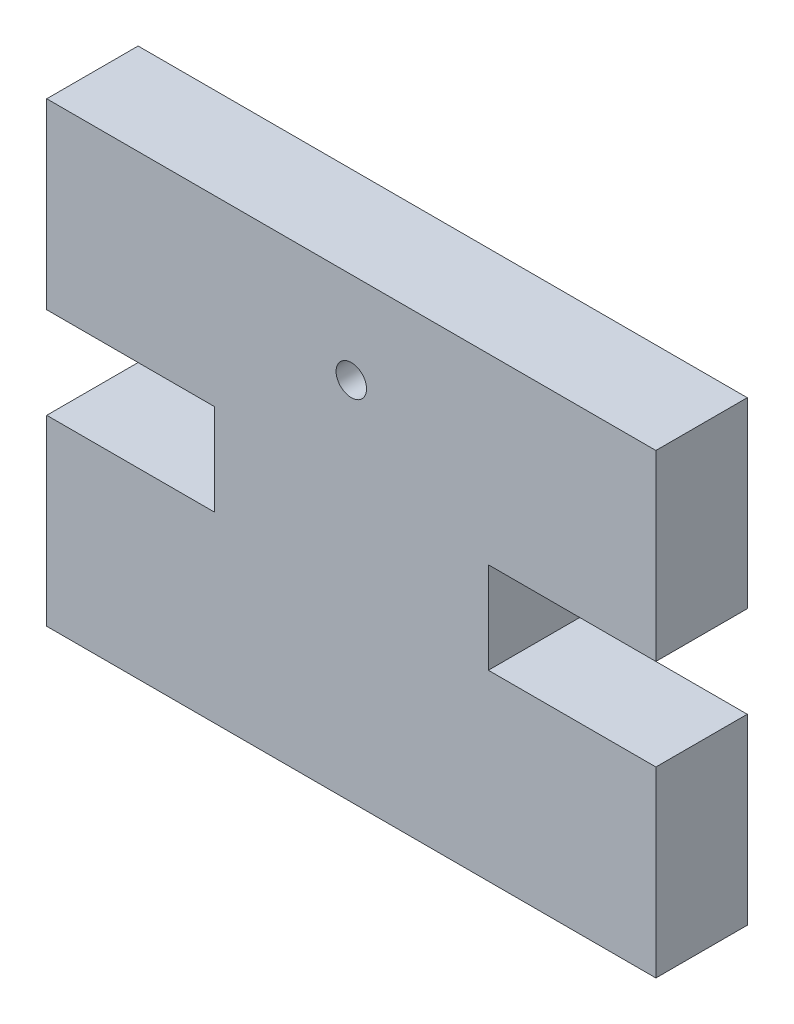
ISO-10303-21;
HEADER;
FILE_DESCRIPTION(('STEP AP214'),'2;1');
FILE_NAME('part.step','',(''),(''),'','','');
FILE_SCHEMA(('AUTOMOTIVE_DESIGN { 1 0 10303 214 1 1 1 1 }'));
ENDSEC;
DATA;
#1=APPLICATION_CONTEXT('core data for automotive mechanical design processes');
#2=APPLICATION_PROTOCOL_DEFINITION('international standard','automotive_design',2000,#1);
#3=PRODUCT_CONTEXT('',#1,'mechanical');
#4=PRODUCT('Part','Part','',(#3));
#5=PRODUCT_RELATED_PRODUCT_CATEGORY('part','',(#4));
#6=PRODUCT_DEFINITION_FORMATION('','',#4);
#7=PRODUCT_DEFINITION_CONTEXT('part definition',#1,'design');
#8=PRODUCT_DEFINITION('design','',#6,#7);
#9=PRODUCT_DEFINITION_SHAPE('','',#8);
#10=(LENGTH_UNIT() NAMED_UNIT(*) SI_UNIT(.MILLI.,.METRE.));
#11=(NAMED_UNIT(*) PLANE_ANGLE_UNIT() SI_UNIT($,.RADIAN.));
#12=(NAMED_UNIT(*) SI_UNIT($,.STERADIAN.) SOLID_ANGLE_UNIT());
#13=UNCERTAINTY_MEASURE_WITH_UNIT(LENGTH_MEASURE(1.E-05),#10,'distance_accuracy_value','');
#14=(GEOMETRIC_REPRESENTATION_CONTEXT(3) GLOBAL_UNCERTAINTY_ASSIGNED_CONTEXT((#13)) GLOBAL_UNIT_ASSIGNED_CONTEXT((#10,
#11,#12)) REPRESENTATION_CONTEXT('',''));
#15=CARTESIAN_POINT('',(0.,0.,0.));
#16=DIRECTION('',(0.,0.,1.));
#17=DIRECTION('',(1.,0.,0.));
#18=AXIS2_PLACEMENT_3D('',#15,#16,#17);
#19=CARTESIAN_POINT('',(0.,0.,3.));
#20=DIRECTION('',(0.,0.,1.));
#21=DIRECTION('',(1.,0.,0.));
#22=AXIS2_PLACEMENT_3D('',#19,#20,#21);
#23=PLANE('',#22);
#24=DIRECTION('',(0.,-1.,0.));
#25=VECTOR('',#24,1.);
#26=CARTESIAN_POINT('',(0.,0.,3.));
#27=LINE('',#26,#25);
#28=CARTESIAN_POINT('',(0.,3.,3.));
#29=VERTEX_POINT('',#28);
#30=CARTESIAN_POINT('',(0.,0.,3.));
#31=VERTEX_POINT('',#30);
#32=EDGE_CURVE('E93',#29,#31,#27,.T.);
#33=ORIENTED_EDGE('',*,*,#32,.T.);
#34=DIRECTION('',(-1.,0.,0.));
#35=VECTOR('',#34,1.);
#36=CARTESIAN_POINT('',(-5.5,0.,3.));
#37=LINE('',#36,#35);
#38=CARTESIAN_POINT('',(-5.5,0.,3.));
#39=VERTEX_POINT('',#38);
#40=EDGE_CURVE('E183',#31,#39,#37,.T.);
#41=ORIENTED_EDGE('',*,*,#40,.T.);
#42=DIRECTION('',(0.,1.,0.));
#43=VECTOR('',#42,1.);
#44=CARTESIAN_POINT('',(-5.5,-6.,3.));
#45=LINE('',#44,#43);
#46=CARTESIAN_POINT('',(-5.5,-6.,3.));
#47=VERTEX_POINT('',#46);
#48=EDGE_CURVE('E230',#47,#39,#45,.T.);
#49=ORIENTED_EDGE('',*,*,#48,.F.);
#50=DIRECTION('',(-1.,0.,0.));
#51=VECTOR('',#50,1.);
#52=CARTESIAN_POINT('',(-5.5,-6.,3.));
#53=LINE('',#52,#51);
#54=CARTESIAN_POINT('',(14.5,-6.,3.));
#55=VERTEX_POINT('',#54);
#56=EDGE_CURVE('E214',#55,#47,#53,.T.);
#57=ORIENTED_EDGE('',*,*,#56,.F.);
#58=DIRECTION('',(0.,1.,0.));
#59=VECTOR('',#58,1.);
#60=CARTESIAN_POINT('',(14.5,-6.,3.));
#61=LINE('',#60,#59);
#62=CARTESIAN_POINT('',(14.5,0.,3.));
#63=VERTEX_POINT('',#62);
#64=EDGE_CURVE('E180',#55,#63,#61,.T.);
#65=ORIENTED_EDGE('',*,*,#64,.T.);
#66=CARTESIAN_POINT('',(9.,0.,3.));
#67=VERTEX_POINT('',#66);
#68=EDGE_CURVE('E243',#63,#67,#37,.T.);
#69=ORIENTED_EDGE('',*,*,#68,.T.);
#70=DIRECTION('',(0.,1.,0.));
#71=VECTOR('',#70,1.);
#72=CARTESIAN_POINT('',(9.,0.,3.));
#73=LINE('',#72,#71);
#74=CARTESIAN_POINT('',(9.,3.,3.));
#75=VERTEX_POINT('',#74);
#76=EDGE_CURVE('E160',#67,#75,#73,.T.);
#77=ORIENTED_EDGE('',*,*,#76,.T.);
#78=DIRECTION('',(1.,0.,0.));
#79=VECTOR('',#78,1.);
#80=CARTESIAN_POINT('',(14.5,3.,3.));
#81=LINE('',#80,#79);
#82=CARTESIAN_POINT('',(14.5,3.,3.));
#83=VERTEX_POINT('',#82);
#84=EDGE_CURVE('E162',#75,#83,#81,.T.);
#85=ORIENTED_EDGE('',*,*,#84,.T.);
#86=DIRECTION('',(0.,1.,0.));
#87=VECTOR('',#86,1.);
#88=CARTESIAN_POINT('',(14.5,9.,3.));
#89=LINE('',#88,#87);
#90=CARTESIAN_POINT('',(14.5,9.,3.));
#91=VERTEX_POINT('',#90);
#92=EDGE_CURVE('E116',#83,#91,#89,.T.);
#93=ORIENTED_EDGE('',*,*,#92,.T.);
#94=DIRECTION('',(-1.,0.,0.));
#95=VECTOR('',#94,1.);
#96=CARTESIAN_POINT('',(-5.5,9.,3.));
#97=LINE('',#96,#95);
#98=CARTESIAN_POINT('',(-5.5,9.,3.));
#99=VERTEX_POINT('',#98);
#100=EDGE_CURVE('E110',#91,#99,#97,.T.);
#101=ORIENTED_EDGE('',*,*,#100,.T.);
#102=DIRECTION('',(0.,-1.,0.));
#103=VECTOR('',#102,1.);
#104=CARTESIAN_POINT('',(-5.5,9.,3.));
#105=LINE('',#104,#103);
#106=CARTESIAN_POINT('',(-5.5,3.,3.));
#107=VERTEX_POINT('',#106);
#108=EDGE_CURVE('E114',#99,#107,#105,.T.);
#109=ORIENTED_EDGE('',*,*,#108,.T.);
#110=DIRECTION('',(1.,0.,0.));
#111=VECTOR('',#110,1.);
#112=CARTESIAN_POINT('',(0.,3.,3.));
#113=LINE('',#112,#111);
#114=EDGE_CURVE('E54',#107,#29,#113,.T.);
#115=ORIENTED_EDGE('',*,*,#114,.T.);
#116=EDGE_LOOP('',(#33,#41,#49,#57,#65,#69,#77,#85,#93,#101,#109,#115));
#117=FACE_BOUND('',#116,.T.);
#118=CARTESIAN_POINT('',(4.5,6.,3.));
#119=DIRECTION('',(0.,0.,1.));
#120=DIRECTION('',(1.,0.,0.));
#121=AXIS2_PLACEMENT_3D('',#118,#119,#120);
#122=CIRCLE('',#121,0.500000000000001);
#123=CARTESIAN_POINT('',(5.,6.,3.));
#124=VERTEX_POINT('',#123);
#125=EDGE_CURVE('E169',#124,#124,#122,.T.);
#126=ORIENTED_EDGE('',*,*,#125,.F.);
#127=EDGE_LOOP('',(#126));
#128=FACE_BOUND('',#127,.T.);
#129=ADVANCED_FACE('F35',(#117,#128),#23,.T.);
#130=CARTESIAN_POINT('',(0.,0.,0.));
#131=DIRECTION('',(0.,0.,1.));
#132=DIRECTION('',(1.,0.,0.));
#133=AXIS2_PLACEMENT_3D('',#130,#131,#132);
#134=PLANE('',#133);
#135=DIRECTION('',(0.,-1.,0.));
#136=VECTOR('',#135,1.);
#137=CARTESIAN_POINT('',(0.,0.,0.));
#138=LINE('',#137,#136);
#139=CARTESIAN_POINT('',(0.,3.,0.));
#140=VERTEX_POINT('',#139);
#141=CARTESIAN_POINT('',(0.,0.,0.));
#142=VERTEX_POINT('',#141);
#143=EDGE_CURVE('E164',#140,#142,#138,.T.);
#144=ORIENTED_EDGE('',*,*,#143,.F.);
#145=DIRECTION('',(1.,0.,0.));
#146=VECTOR('',#145,1.);
#147=CARTESIAN_POINT('',(0.,3.,0.));
#148=LINE('',#147,#146);
#149=CARTESIAN_POINT('',(-5.5,3.,0.));
#150=VERTEX_POINT('',#149);
#151=EDGE_CURVE('E87',#150,#140,#148,.T.);
#152=ORIENTED_EDGE('',*,*,#151,.F.);
#153=DIRECTION('',(0.,-1.,0.));
#154=VECTOR('',#153,1.);
#155=CARTESIAN_POINT('',(-5.5,9.,0.));
#156=LINE('',#155,#154);
#157=CARTESIAN_POINT('',(-5.5,9.,0.));
#158=VERTEX_POINT('',#157);
#159=EDGE_CURVE('E81',#158,#150,#156,.T.);
#160=ORIENTED_EDGE('',*,*,#159,.F.);
#161=DIRECTION('',(-1.,0.,0.));
#162=VECTOR('',#161,1.);
#163=CARTESIAN_POINT('',(-5.5,9.,0.));
#164=LINE('',#163,#162);
#165=CARTESIAN_POINT('',(14.5,9.,0.));
#166=VERTEX_POINT('',#165);
#167=EDGE_CURVE('E124',#166,#158,#164,.T.);
#168=ORIENTED_EDGE('',*,*,#167,.F.);
#169=DIRECTION('',(0.,1.,0.));
#170=VECTOR('',#169,1.);
#171=CARTESIAN_POINT('',(14.5,9.,0.));
#172=LINE('',#171,#170);
#173=CARTESIAN_POINT('',(14.5,3.,0.));
#174=VERTEX_POINT('',#173);
#175=EDGE_CURVE('E136',#174,#166,#172,.T.);
#176=ORIENTED_EDGE('',*,*,#175,.F.);
#177=DIRECTION('',(1.,0.,0.));
#178=VECTOR('',#177,1.);
#179=CARTESIAN_POINT('',(14.5,3.,0.));
#180=LINE('',#179,#178);
#181=CARTESIAN_POINT('',(9.,3.,0.));
#182=VERTEX_POINT('',#181);
#183=EDGE_CURVE('E134',#182,#174,#180,.T.);
#184=ORIENTED_EDGE('',*,*,#183,.F.);
#185=DIRECTION('',(0.,1.,0.));
#186=VECTOR('',#185,1.);
#187=CARTESIAN_POINT('',(9.,0.,0.));
#188=LINE('',#187,#186);
#189=CARTESIAN_POINT('',(9.,0.,0.));
#190=VERTEX_POINT('',#189);
#191=EDGE_CURVE('E137',#190,#182,#188,.T.);
#192=ORIENTED_EDGE('',*,*,#191,.F.);
#193=DIRECTION('',(1.,0.,0.));
#194=VECTOR('',#193,1.);
#195=CARTESIAN_POINT('',(-5.5,0.,0.));
#196=LINE('',#195,#194);
#197=CARTESIAN_POINT('',(14.5,0.,0.));
#198=VERTEX_POINT('',#197);
#199=EDGE_CURVE('E211',#190,#198,#196,.T.);
#200=ORIENTED_EDGE('',*,*,#199,.T.);
#201=DIRECTION('',(0.,1.,0.));
#202=VECTOR('',#201,1.);
#203=CARTESIAN_POINT('',(14.5,-6.,0.));
#204=LINE('',#203,#202);
#205=CARTESIAN_POINT('',(14.5,-6.,0.));
#206=VERTEX_POINT('',#205);
#207=EDGE_CURVE('E225',#206,#198,#204,.T.);
#208=ORIENTED_EDGE('',*,*,#207,.F.);
#209=DIRECTION('',(1.,0.,0.));
#210=VECTOR('',#209,1.);
#211=CARTESIAN_POINT('',(-5.5,-6.,0.));
#212=LINE('',#211,#210);
#213=CARTESIAN_POINT('',(-5.5,-6.,0.));
#214=VERTEX_POINT('',#213);
#215=EDGE_CURVE('E229',#214,#206,#212,.T.);
#216=ORIENTED_EDGE('',*,*,#215,.F.);
#217=DIRECTION('',(0.,1.,0.));
#218=VECTOR('',#217,1.);
#219=CARTESIAN_POINT('',(-5.5,-6.,0.));
#220=LINE('',#219,#218);
#221=CARTESIAN_POINT('',(-5.5,0.,0.));
#222=VERTEX_POINT('',#221);
#223=EDGE_CURVE('E206',#214,#222,#220,.T.);
#224=ORIENTED_EDGE('',*,*,#223,.T.);
#225=EDGE_CURVE('E202',#222,#142,#196,.T.);
#226=ORIENTED_EDGE('',*,*,#225,.T.);
#227=EDGE_LOOP('',(#144,#152,#160,#168,#176,#184,#192,#200,#208,#216,#224,#226));
#228=FACE_BOUND('',#227,.T.);
#229=CARTESIAN_POINT('',(4.5,6.,0.));
#230=DIRECTION('',(0.,0.,1.));
#231=DIRECTION('',(1.,0.,0.));
#232=AXIS2_PLACEMENT_3D('',#229,#230,#231);
#233=CIRCLE('',#232,0.500000000000001);
#234=CARTESIAN_POINT('',(5.,6.,0.));
#235=VERTEX_POINT('',#234);
#236=EDGE_CURVE('E173',#235,#235,#233,.T.);
#237=ORIENTED_EDGE('',*,*,#236,.T.);
#238=EDGE_LOOP('',(#237));
#239=FACE_BOUND('',#238,.T.);
#240=ADVANCED_FACE('F197',(#228,#239),#134,.F.);
#241=CARTESIAN_POINT('',(0.,0.,3.));
#242=DIRECTION('',(1.,0.,0.));
#243=DIRECTION('',(0.,0.,-1.));
#244=AXIS2_PLACEMENT_3D('',#241,#242,#243);
#245=PLANE('',#244);
#246=ORIENTED_EDGE('',*,*,#143,.T.);
#247=DIRECTION('',(0.,0.,-1.));
#248=VECTOR('',#247,1.);
#249=CARTESIAN_POINT('',(0.,0.,3.));
#250=LINE('',#249,#248);
#251=EDGE_CURVE('E11',#31,#142,#250,.T.);
#252=ORIENTED_EDGE('',*,*,#251,.F.);
#253=ORIENTED_EDGE('',*,*,#32,.F.);
#254=DIRECTION('',(0.,0.,-1.));
#255=VECTOR('',#254,1.);
#256=CARTESIAN_POINT('',(0.,3.,3.));
#257=LINE('',#256,#255);
#258=EDGE_CURVE('E130',#29,#140,#257,.T.);
#259=ORIENTED_EDGE('',*,*,#258,.T.);
#260=EDGE_LOOP('',(#246,#252,#253,#259));
#261=FACE_BOUND('',#260,.T.);
#262=ADVANCED_FACE('F37',(#261),#245,.F.);
#263=CARTESIAN_POINT('',(9.,0.,3.));
#264=DIRECTION('',(-1.,0.,0.));
#265=DIRECTION('',(0.,0.,1.));
#266=AXIS2_PLACEMENT_3D('',#263,#264,#265);
#267=PLANE('',#266);
#268=ORIENTED_EDGE('',*,*,#191,.T.);
#269=DIRECTION('',(0.,0.,-1.));
#270=VECTOR('',#269,1.);
#271=CARTESIAN_POINT('',(9.,3.,3.));
#272=LINE('',#271,#270);
#273=EDGE_CURVE('E148',#75,#182,#272,.T.);
#274=ORIENTED_EDGE('',*,*,#273,.F.);
#275=ORIENTED_EDGE('',*,*,#76,.F.);
#276=DIRECTION('',(0.,0.,-1.));
#277=VECTOR('',#276,1.);
#278=CARTESIAN_POINT('',(9.,0.,3.));
#279=LINE('',#278,#277);
#280=EDGE_CURVE('E45',#67,#190,#279,.T.);
#281=ORIENTED_EDGE('',*,*,#280,.T.);
#282=EDGE_LOOP('',(#268,#274,#275,#281));
#283=FACE_BOUND('',#282,.T.);
#284=ADVANCED_FACE('F307',(#283),#267,.F.);
#285=CARTESIAN_POINT('',(14.5,3.,3.));
#286=DIRECTION('',(0.,1.,0.));
#287=DIRECTION('',(-1.,0.,0.));
#288=AXIS2_PLACEMENT_3D('',#285,#286,#287);
#289=PLANE('',#288);
#290=ORIENTED_EDGE('',*,*,#183,.T.);
#291=DIRECTION('',(0.,0.,-1.));
#292=VECTOR('',#291,1.);
#293=CARTESIAN_POINT('',(14.5,3.,3.));
#294=LINE('',#293,#292);
#295=EDGE_CURVE('E145',#83,#174,#294,.T.);
#296=ORIENTED_EDGE('',*,*,#295,.F.);
#297=ORIENTED_EDGE('',*,*,#84,.F.);
#298=ORIENTED_EDGE('',*,*,#273,.T.);
#299=EDGE_LOOP('',(#290,#296,#297,#298));
#300=FACE_BOUND('',#299,.T.);
#301=ADVANCED_FACE('F191',(#300),#289,.F.);
#302=CARTESIAN_POINT('',(14.5,9.,3.));
#303=DIRECTION('',(-1.,0.,0.));
#304=DIRECTION('',(0.,-1.,0.));
#305=AXIS2_PLACEMENT_3D('',#302,#303,#304);
#306=PLANE('',#305);
#307=ORIENTED_EDGE('',*,*,#175,.T.);
#308=DIRECTION('',(0.,0.,-1.));
#309=VECTOR('',#308,1.);
#310=CARTESIAN_POINT('',(14.5,9.,3.));
#311=LINE('',#310,#309);
#312=EDGE_CURVE('E125',#91,#166,#311,.T.);
#313=ORIENTED_EDGE('',*,*,#312,.F.);
#314=ORIENTED_EDGE('',*,*,#92,.F.);
#315=ORIENTED_EDGE('',*,*,#295,.T.);
#316=EDGE_LOOP('',(#307,#313,#314,#315));
#317=FACE_BOUND('',#316,.T.);
#318=ADVANCED_FACE('F195',(#317),#306,.F.);
#319=CARTESIAN_POINT('',(-5.5,9.,3.));
#320=DIRECTION('',(0.,-1.,0.));
#321=DIRECTION('',(1.,0.,0.));
#322=AXIS2_PLACEMENT_3D('',#319,#320,#321);
#323=PLANE('',#322);
#324=ORIENTED_EDGE('',*,*,#167,.T.);
#325=DIRECTION('',(0.,0.,-1.));
#326=VECTOR('',#325,1.);
#327=CARTESIAN_POINT('',(-5.5,9.,3.));
#328=LINE('',#327,#326);
#329=EDGE_CURVE('E121',#99,#158,#328,.T.);
#330=ORIENTED_EDGE('',*,*,#329,.F.);
#331=ORIENTED_EDGE('',*,*,#100,.F.);
#332=ORIENTED_EDGE('',*,*,#312,.T.);
#333=EDGE_LOOP('',(#324,#330,#331,#332));
#334=FACE_BOUND('',#333,.T.);
#335=ADVANCED_FACE('F122',(#334),#323,.F.);
#336=CARTESIAN_POINT('',(-5.5,9.,3.));
#337=DIRECTION('',(1.,0.,0.));
#338=DIRECTION('',(0.,1.,0.));
#339=AXIS2_PLACEMENT_3D('',#336,#337,#338);
#340=PLANE('',#339);
#341=ORIENTED_EDGE('',*,*,#159,.T.);
#342=DIRECTION('',(0.,0.,-1.));
#343=VECTOR('',#342,1.);
#344=CARTESIAN_POINT('',(-5.5,3.,3.));
#345=LINE('',#344,#343);
#346=EDGE_CURVE('E126',#107,#150,#345,.T.);
#347=ORIENTED_EDGE('',*,*,#346,.F.);
#348=ORIENTED_EDGE('',*,*,#108,.F.);
#349=ORIENTED_EDGE('',*,*,#329,.T.);
#350=EDGE_LOOP('',(#341,#347,#348,#349));
#351=FACE_BOUND('',#350,.T.);
#352=ADVANCED_FACE('F128',(#351),#340,.F.);
#353=CARTESIAN_POINT('',(0.,3.,3.));
#354=DIRECTION('',(0.,1.,0.));
#355=DIRECTION('',(-1.,0.,0.));
#356=AXIS2_PLACEMENT_3D('',#353,#354,#355);
#357=PLANE('',#356);
#358=ORIENTED_EDGE('',*,*,#151,.T.);
#359=ORIENTED_EDGE('',*,*,#258,.F.);
#360=ORIENTED_EDGE('',*,*,#114,.F.);
#361=ORIENTED_EDGE('',*,*,#346,.T.);
#362=EDGE_LOOP('',(#358,#359,#360,#361));
#363=FACE_BOUND('',#362,.T.);
#364=ADVANCED_FACE('F297',(#363),#357,.F.);
#365=CARTESIAN_POINT('',(4.5,6.,3.));
#366=DIRECTION('',(0.,0.,-1.));
#367=DIRECTION('',(-1.,0.,0.));
#368=AXIS2_PLACEMENT_3D('',#365,#366,#367);
#369=CYLINDRICAL_SURFACE('',#368,0.500000000000001);
#370=ORIENTED_EDGE('',*,*,#125,.T.);
#371=EDGE_LOOP('',(#370));
#372=FACE_BOUND('',#371,.T.);
#373=ORIENTED_EDGE('',*,*,#236,.F.);
#374=EDGE_LOOP('',(#373));
#375=FACE_BOUND('',#374,.T.);
#376=ADVANCED_FACE('F294',(#372,#375),#369,.F.);
#377=CARTESIAN_POINT('',(0.,0.,0.));
#378=DIRECTION('',(0.,-1.,0.));
#379=DIRECTION('',(0.,0.,-1.));
#380=AXIS2_PLACEMENT_3D('',#377,#378,#379);
#381=PLANE('',#380);
#382=ORIENTED_EDGE('',*,*,#40,.F.);
#383=ORIENTED_EDGE('',*,*,#251,.T.);
#384=ORIENTED_EDGE('',*,*,#225,.F.);
#385=DIRECTION('',(0.,0.,-1.));
#386=VECTOR('',#385,1.);
#387=CARTESIAN_POINT('',(-5.5,0.,3.));
#388=LINE('',#387,#386);
#389=EDGE_CURVE('E217',#39,#222,#388,.T.);
#390=ORIENTED_EDGE('',*,*,#389,.F.);
#391=EDGE_LOOP('',(#382,#383,#384,#390));
#392=FACE_BOUND('',#391,.T.);
#393=ADVANCED_FACE('F265',(#392),#381,.F.);
#394=CARTESIAN_POINT('',(14.5,-6.,3.));
#395=DIRECTION('',(-1.,0.,0.));
#396=DIRECTION('',(0.,0.,1.));
#397=AXIS2_PLACEMENT_3D('',#394,#395,#396);
#398=PLANE('',#397);
#399=DIRECTION('',(0.,0.,1.));
#400=VECTOR('',#399,1.);
#401=CARTESIAN_POINT('',(14.5,0.,3.));
#402=LINE('',#401,#400);
#403=EDGE_CURVE('E250',#198,#63,#402,.T.);
#404=ORIENTED_EDGE('',*,*,#403,.T.);
#405=ORIENTED_EDGE('',*,*,#64,.F.);
#406=DIRECTION('',(0.,0.,1.));
#407=VECTOR('',#406,1.);
#408=CARTESIAN_POINT('',(14.5,-6.,3.));
#409=LINE('',#408,#407);
#410=EDGE_CURVE('E210',#206,#55,#409,.T.);
#411=ORIENTED_EDGE('',*,*,#410,.F.);
#412=ORIENTED_EDGE('',*,*,#207,.T.);
#413=EDGE_LOOP('',(#404,#405,#411,#412));
#414=FACE_BOUND('',#413,.T.);
#415=ADVANCED_FACE('F251',(#414),#398,.F.);
#416=CARTESIAN_POINT('',(-5.5,-6.,3.));
#417=DIRECTION('',(1.,0.,0.));
#418=DIRECTION('',(0.,0.,-1.));
#419=AXIS2_PLACEMENT_3D('',#416,#417,#418);
#420=PLANE('',#419);
#421=ORIENTED_EDGE('',*,*,#389,.T.);
#422=ORIENTED_EDGE('',*,*,#223,.F.);
#423=DIRECTION('',(0.,0.,-1.));
#424=VECTOR('',#423,1.);
#425=CARTESIAN_POINT('',(-5.5,-6.,3.));
#426=LINE('',#425,#424);
#427=EDGE_CURVE('E276',#47,#214,#426,.T.);
#428=ORIENTED_EDGE('',*,*,#427,.F.);
#429=ORIENTED_EDGE('',*,*,#48,.T.);
#430=EDGE_LOOP('',(#421,#422,#428,#429));
#431=FACE_BOUND('',#430,.T.);
#432=ADVANCED_FACE('F261',(#431),#420,.F.);
#433=CARTESIAN_POINT('',(0.,-6.,0.));
#434=DIRECTION('',(0.,-1.,0.));
#435=DIRECTION('',(0.,0.,-1.));
#436=AXIS2_PLACEMENT_3D('',#433,#434,#435);
#437=PLANE('',#436);
#438=ORIENTED_EDGE('',*,*,#410,.T.);
#439=ORIENTED_EDGE('',*,*,#56,.T.);
#440=ORIENTED_EDGE('',*,*,#427,.T.);
#441=ORIENTED_EDGE('',*,*,#215,.T.);
#442=EDGE_LOOP('',(#438,#439,#440,#441));
#443=FACE_BOUND('',#442,.T.);
#444=ADVANCED_FACE('F275',(#443),#437,.T.);
#445=ORIENTED_EDGE('',*,*,#280,.F.);
#446=ORIENTED_EDGE('',*,*,#68,.F.);
#447=ORIENTED_EDGE('',*,*,#403,.F.);
#448=ORIENTED_EDGE('',*,*,#199,.F.);
#449=EDGE_LOOP('',(#445,#446,#447,#448));
#450=FACE_BOUND('',#449,.T.);
#451=ADVANCED_FACE('F279',(#450),#381,.F.);
#452=CLOSED_SHELL('',(#129,#240,#262,#284,#301,#318,#335,#352,#364,#376,#393,#415,#432,#444,#451));
#453=MANIFOLD_SOLID_BREP('B2',#452);
#454=ADVANCED_BREP_SHAPE_REPRESENTATION('',(#18,#453),#14);
#455=SHAPE_DEFINITION_REPRESENTATION(#9,#454);
ENDSEC;
END-ISO-10303-21;
